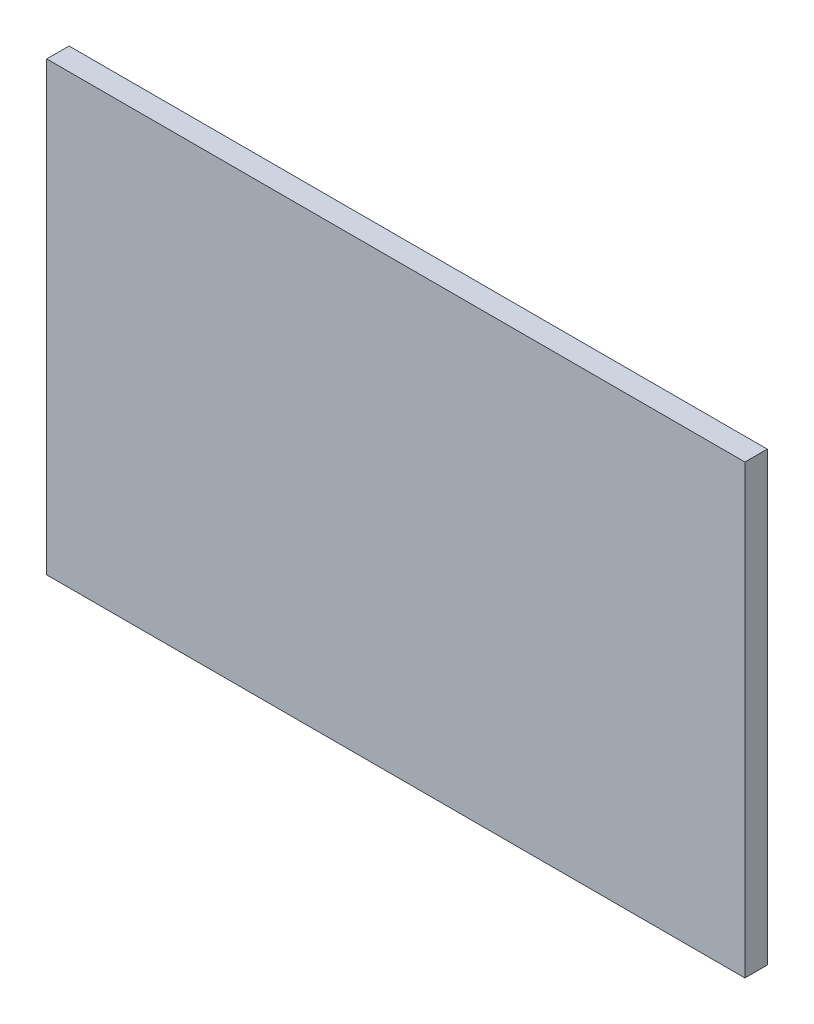
ISO-10303-21;
HEADER;
FILE_DESCRIPTION(('STEP AP214'),'2;1');
FILE_NAME('part.step','',(''),(''),'','','');
FILE_SCHEMA(('AUTOMOTIVE_DESIGN { 1 0 10303 214 1 1 1 1 }'));
ENDSEC;
DATA;
#1=APPLICATION_CONTEXT('core data for automotive mechanical design processes');
#2=APPLICATION_PROTOCOL_DEFINITION('international standard','automotive_design',2000,#1);
#3=PRODUCT_CONTEXT('',#1,'mechanical');
#4=PRODUCT('Part','Part','',(#3));
#5=PRODUCT_RELATED_PRODUCT_CATEGORY('part','',(#4));
#6=PRODUCT_DEFINITION_FORMATION('','',#4);
#7=PRODUCT_DEFINITION_CONTEXT('part definition',#1,'design');
#8=PRODUCT_DEFINITION('design','',#6,#7);
#9=PRODUCT_DEFINITION_SHAPE('','',#8);
#10=(LENGTH_UNIT() NAMED_UNIT(*) SI_UNIT(.MILLI.,.METRE.));
#11=(NAMED_UNIT(*) PLANE_ANGLE_UNIT() SI_UNIT($,.RADIAN.));
#12=(NAMED_UNIT(*) SI_UNIT($,.STERADIAN.) SOLID_ANGLE_UNIT());
#13=UNCERTAINTY_MEASURE_WITH_UNIT(LENGTH_MEASURE(1.E-05),#10,'distance_accuracy_value','');
#14=(GEOMETRIC_REPRESENTATION_CONTEXT(3) GLOBAL_UNCERTAINTY_ASSIGNED_CONTEXT((#13)) GLOBAL_UNIT_ASSIGNED_CONTEXT((#10,
#11,#12)) REPRESENTATION_CONTEXT('',''));
#15=CARTESIAN_POINT('',(0.,0.,0.));
#16=DIRECTION('',(0.,0.,1.));
#17=DIRECTION('',(1.,0.,0.));
#18=AXIS2_PLACEMENT_3D('',#15,#16,#17);
#19=CARTESIAN_POINT('',(0.,0.,8.));
#20=DIRECTION('',(1.,0.,0.));
#21=DIRECTION('',(0.,0.,-1.));
#22=AXIS2_PLACEMENT_3D('',#19,#20,#21);
#23=PLANE('',#22);
#24=DIRECTION('',(0.,-1.,0.));
#25=VECTOR('',#24,1.);
#26=CARTESIAN_POINT('',(0.,0.,0.));
#27=LINE('',#26,#25);
#28=CARTESIAN_POINT('',(0.,160.,0.));
#29=VERTEX_POINT('',#28);
#30=CARTESIAN_POINT('',(0.,0.,0.));
#31=VERTEX_POINT('',#30);
#32=EDGE_CURVE('E96',#29,#31,#27,.T.);
#33=ORIENTED_EDGE('',*,*,#32,.T.);
#34=DIRECTION('',(0.,0.,-1.));
#35=VECTOR('',#34,1.);
#36=CARTESIAN_POINT('',(0.,0.,8.));
#37=LINE('',#36,#35);
#38=CARTESIAN_POINT('',(0.,0.,8.));
#39=VERTEX_POINT('',#38);
#40=EDGE_CURVE('E11',#39,#31,#37,.T.);
#41=ORIENTED_EDGE('',*,*,#40,.F.);
#42=DIRECTION('',(0.,-1.,0.));
#43=VECTOR('',#42,1.);
#44=CARTESIAN_POINT('',(0.,0.,8.));
#45=LINE('',#44,#43);
#46=CARTESIAN_POINT('',(0.,160.,8.));
#47=VERTEX_POINT('',#46);
#48=EDGE_CURVE('E84',#47,#39,#45,.T.);
#49=ORIENTED_EDGE('',*,*,#48,.F.);
#50=DIRECTION('',(0.,0.,-1.));
#51=VECTOR('',#50,1.);
#52=CARTESIAN_POINT('',(0.,160.,8.));
#53=LINE('',#52,#51);
#54=EDGE_CURVE('E92',#47,#29,#53,.T.);
#55=ORIENTED_EDGE('',*,*,#54,.T.);
#56=EDGE_LOOP('',(#33,#41,#49,#55));
#57=FACE_BOUND('',#56,.T.);
#58=ADVANCED_FACE('F33',(#57),#23,.F.);
#59=CARTESIAN_POINT('',(0.,0.,8.));
#60=DIRECTION('',(0.,1.,0.));
#61=DIRECTION('',(0.,0.,1.));
#62=AXIS2_PLACEMENT_3D('',#59,#60,#61);
#63=PLANE('',#62);
#64=DIRECTION('',(1.,0.,0.));
#65=VECTOR('',#64,1.);
#66=CARTESIAN_POINT('',(0.,0.,0.));
#67=LINE('',#66,#65);
#68=CARTESIAN_POINT('',(250.,0.,0.));
#69=VERTEX_POINT('',#68);
#70=EDGE_CURVE('E88',#31,#69,#67,.T.);
#71=ORIENTED_EDGE('',*,*,#70,.T.);
#72=DIRECTION('',(0.,0.,-1.));
#73=VECTOR('',#72,1.);
#74=CARTESIAN_POINT('',(250.,0.,8.));
#75=LINE('',#74,#73);
#76=CARTESIAN_POINT('',(250.,0.,8.));
#77=VERTEX_POINT('',#76);
#78=EDGE_CURVE('E41',#77,#69,#75,.T.);
#79=ORIENTED_EDGE('',*,*,#78,.F.);
#80=DIRECTION('',(1.,0.,0.));
#81=VECTOR('',#80,1.);
#82=CARTESIAN_POINT('',(0.,0.,8.));
#83=LINE('',#82,#81);
#84=EDGE_CURVE('E79',#39,#77,#83,.T.);
#85=ORIENTED_EDGE('',*,*,#84,.F.);
#86=ORIENTED_EDGE('',*,*,#40,.T.);
#87=EDGE_LOOP('',(#71,#79,#85,#86));
#88=FACE_BOUND('',#87,.T.);
#89=ADVANCED_FACE('F87',(#88),#63,.F.);
#90=CARTESIAN_POINT('',(250.,0.,8.));
#91=DIRECTION('',(-1.,0.,0.));
#92=DIRECTION('',(0.,0.,1.));
#93=AXIS2_PLACEMENT_3D('',#90,#91,#92);
#94=PLANE('',#93);
#95=DIRECTION('',(0.,1.,0.));
#96=VECTOR('',#95,1.);
#97=CARTESIAN_POINT('',(250.,0.,0.));
#98=LINE('',#97,#96);
#99=CARTESIAN_POINT('',(250.,160.,0.));
#100=VERTEX_POINT('',#99);
#101=EDGE_CURVE('E66',#69,#100,#98,.T.);
#102=ORIENTED_EDGE('',*,*,#101,.T.);
#103=DIRECTION('',(0.,0.,-1.));
#104=VECTOR('',#103,1.);
#105=CARTESIAN_POINT('',(250.,160.,8.));
#106=LINE('',#105,#104);
#107=CARTESIAN_POINT('',(250.,160.,8.));
#108=VERTEX_POINT('',#107);
#109=EDGE_CURVE('E89',#108,#100,#106,.T.);
#110=ORIENTED_EDGE('',*,*,#109,.F.);
#111=DIRECTION('',(0.,1.,0.));
#112=VECTOR('',#111,1.);
#113=CARTESIAN_POINT('',(250.,0.,8.));
#114=LINE('',#113,#112);
#115=EDGE_CURVE('E82',#77,#108,#114,.T.);
#116=ORIENTED_EDGE('',*,*,#115,.F.);
#117=ORIENTED_EDGE('',*,*,#78,.T.);
#118=EDGE_LOOP('',(#102,#110,#116,#117));
#119=FACE_BOUND('',#118,.T.);
#120=ADVANCED_FACE('F90',(#119),#94,.F.);
#121=CARTESIAN_POINT('',(0.,160.,8.));
#122=DIRECTION('',(0.,-1.,0.));
#123=DIRECTION('',(0.,0.,-1.));
#124=AXIS2_PLACEMENT_3D('',#121,#122,#123);
#125=PLANE('',#124);
#126=DIRECTION('',(-1.,0.,0.));
#127=VECTOR('',#126,1.);
#128=CARTESIAN_POINT('',(0.,160.,0.));
#129=LINE('',#128,#127);
#130=EDGE_CURVE('E72',#100,#29,#129,.T.);
#131=ORIENTED_EDGE('',*,*,#130,.T.);
#132=ORIENTED_EDGE('',*,*,#54,.F.);
#133=DIRECTION('',(-1.,0.,0.));
#134=VECTOR('',#133,1.);
#135=CARTESIAN_POINT('',(0.,160.,8.));
#136=LINE('',#135,#134);
#137=EDGE_CURVE('E49',#108,#47,#136,.T.);
#138=ORIENTED_EDGE('',*,*,#137,.F.);
#139=ORIENTED_EDGE('',*,*,#109,.T.);
#140=EDGE_LOOP('',(#131,#132,#138,#139));
#141=FACE_BOUND('',#140,.T.);
#142=ADVANCED_FACE('F103',(#141),#125,.F.);
#143=CARTESIAN_POINT('',(0.,0.,8.));
#144=DIRECTION('',(0.,0.,-1.));
#145=DIRECTION('',(-1.,0.,0.));
#146=AXIS2_PLACEMENT_3D('',#143,#144,#145);
#147=PLANE('',#146);
#148=ORIENTED_EDGE('',*,*,#48,.T.);
#149=ORIENTED_EDGE('',*,*,#84,.T.);
#150=ORIENTED_EDGE('',*,*,#115,.T.);
#151=ORIENTED_EDGE('',*,*,#137,.T.);
#152=EDGE_LOOP('',(#148,#149,#150,#151));
#153=FACE_BOUND('',#152,.T.);
#154=ADVANCED_FACE('F80',(#153),#147,.F.);
#155=CARTESIAN_POINT('',(0.,0.,0.));
#156=DIRECTION('',(0.,0.,-1.));
#157=DIRECTION('',(-1.,0.,0.));
#158=AXIS2_PLACEMENT_3D('',#155,#156,#157);
#159=PLANE('',#158);
#160=ORIENTED_EDGE('',*,*,#32,.F.);
#161=ORIENTED_EDGE('',*,*,#130,.F.);
#162=ORIENTED_EDGE('',*,*,#101,.F.);
#163=ORIENTED_EDGE('',*,*,#70,.F.);
#164=EDGE_LOOP('',(#160,#161,#162,#163));
#165=FACE_BOUND('',#164,.T.);
#166=ADVANCED_FACE('F106',(#165),#159,.T.);
#167=CLOSED_SHELL('',(#58,#89,#120,#142,#154,#166));
#168=MANIFOLD_SOLID_BREP('B2',#167);
#169=ADVANCED_BREP_SHAPE_REPRESENTATION('',(#18,#168),#14);
#170=SHAPE_DEFINITION_REPRESENTATION(#9,#169);
ENDSEC;
END-ISO-10303-21;
